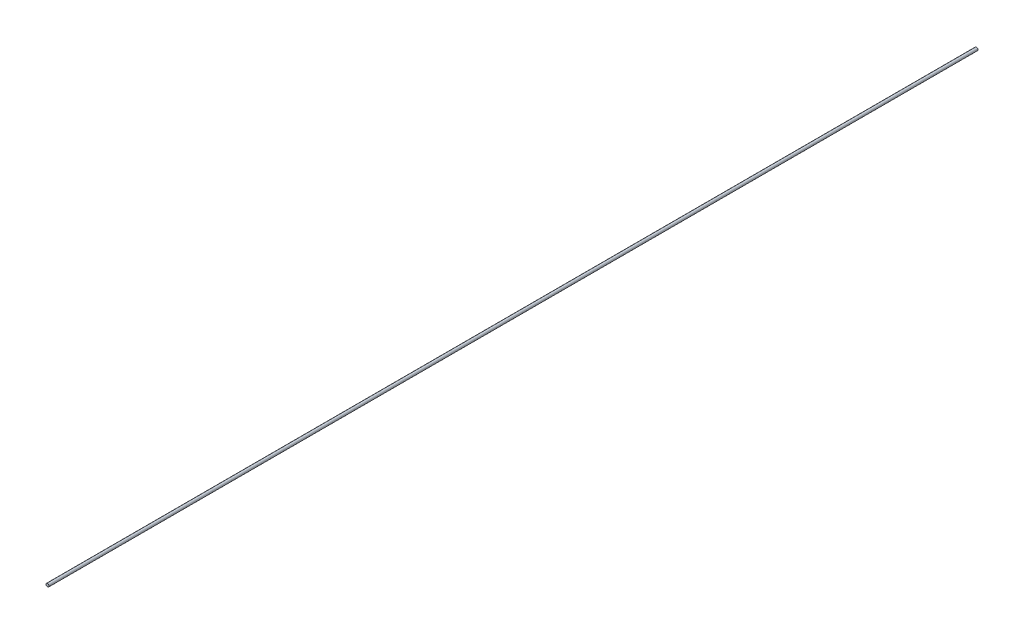
ISO-10303-21;
HEADER;
FILE_DESCRIPTION(('STEP AP214'),'2;1');
FILE_NAME('part.step','',(''),(''),'','','');
FILE_SCHEMA(('AUTOMOTIVE_DESIGN { 1 0 10303 214 1 1 1 1 }'));
ENDSEC;
DATA;
#1=APPLICATION_CONTEXT('core data for automotive mechanical design processes');
#2=APPLICATION_PROTOCOL_DEFINITION('international standard','automotive_design',2000,#1);
#3=PRODUCT_CONTEXT('',#1,'mechanical');
#4=PRODUCT('Part','Part','',(#3));
#5=PRODUCT_RELATED_PRODUCT_CATEGORY('part','',(#4));
#6=PRODUCT_DEFINITION_FORMATION('','',#4);
#7=PRODUCT_DEFINITION_CONTEXT('part definition',#1,'design');
#8=PRODUCT_DEFINITION('design','',#6,#7);
#9=PRODUCT_DEFINITION_SHAPE('','',#8);
#10=(LENGTH_UNIT() NAMED_UNIT(*) SI_UNIT(.MILLI.,.METRE.));
#11=(NAMED_UNIT(*) PLANE_ANGLE_UNIT() SI_UNIT($,.RADIAN.));
#12=(NAMED_UNIT(*) SI_UNIT($,.STERADIAN.) SOLID_ANGLE_UNIT());
#13=UNCERTAINTY_MEASURE_WITH_UNIT(LENGTH_MEASURE(1.E-05),#10,'distance_accuracy_value','');
#14=(GEOMETRIC_REPRESENTATION_CONTEXT(3) GLOBAL_UNCERTAINTY_ASSIGNED_CONTEXT((#13)) GLOBAL_UNIT_ASSIGNED_CONTEXT((#10,
#11,#12)) REPRESENTATION_CONTEXT('',''));
#15=CARTESIAN_POINT('',(0.,0.,0.));
#16=DIRECTION('',(0.,0.,1.));
#17=DIRECTION('',(1.,0.,0.));
#18=AXIS2_PLACEMENT_3D('',#15,#16,#17);
#19=CARTESIAN_POINT('',(0.,0.,610.));
#20=DIRECTION('',(0.,0.,-1.));
#21=DIRECTION('',(-1.,0.,0.));
#22=AXIS2_PLACEMENT_3D('',#19,#20,#21);
#23=CYLINDRICAL_SURFACE('',#22,1.);
#24=CARTESIAN_POINT('',(0.,0.,610.));
#25=DIRECTION('',(0.,0.,1.));
#26=DIRECTION('',(1.,0.,0.));
#27=AXIS2_PLACEMENT_3D('',#24,#25,#26);
#28=CIRCLE('',#27,1.);
#29=CARTESIAN_POINT('',(1.,0.,610.));
#30=VERTEX_POINT('',#29);
#31=EDGE_CURVE('E10',#30,#30,#28,.T.);
#32=ORIENTED_EDGE('',*,*,#31,.F.);
#33=EDGE_LOOP('',(#32));
#34=FACE_BOUND('',#33,.T.);
#35=CARTESIAN_POINT('',(0.,0.,0.));
#36=DIRECTION('',(0.,0.,1.));
#37=DIRECTION('',(1.,0.,0.));
#38=AXIS2_PLACEMENT_3D('',#35,#36,#37);
#39=CIRCLE('',#38,1.);
#40=CARTESIAN_POINT('',(1.,0.,0.));
#41=VERTEX_POINT('',#40);
#42=EDGE_CURVE('E38',#41,#41,#39,.T.);
#43=ORIENTED_EDGE('',*,*,#42,.T.);
#44=EDGE_LOOP('',(#43));
#45=FACE_BOUND('',#44,.T.);
#46=ADVANCED_FACE('F35',(#34,#45),#23,.T.);
#47=CARTESIAN_POINT('',(0.,0.,610.));
#48=DIRECTION('',(0.,0.,1.));
#49=DIRECTION('',(1.,0.,0.));
#50=AXIS2_PLACEMENT_3D('',#47,#48,#49);
#51=PLANE('',#50);
#52=ORIENTED_EDGE('',*,*,#31,.T.);
#53=EDGE_LOOP('',(#52));
#54=FACE_BOUND('',#53,.T.);
#55=ADVANCED_FACE('F50',(#54),#51,.T.);
#56=CARTESIAN_POINT('',(0.,0.,0.));
#57=DIRECTION('',(0.,0.,1.));
#58=DIRECTION('',(1.,0.,0.));
#59=AXIS2_PLACEMENT_3D('',#56,#57,#58);
#60=PLANE('',#59);
#61=ORIENTED_EDGE('',*,*,#42,.F.);
#62=EDGE_LOOP('',(#61));
#63=FACE_BOUND('',#62,.T.);
#64=ADVANCED_FACE('F48',(#63),#60,.F.);
#65=CLOSED_SHELL('',(#46,#55,#64));
#66=MANIFOLD_SOLID_BREP('B2',#65);
#67=ADVANCED_BREP_SHAPE_REPRESENTATION('',(#18,#66),#14);
#68=SHAPE_DEFINITION_REPRESENTATION(#9,#67);
ENDSEC;
END-ISO-10303-21;
